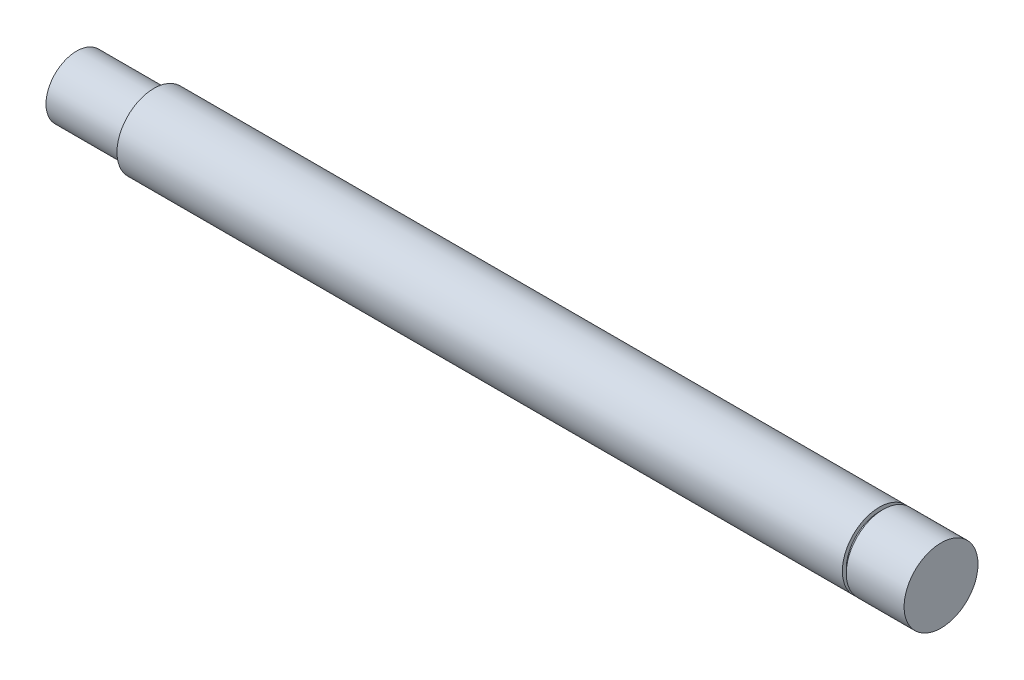
ISO-10303-21;
HEADER;
FILE_DESCRIPTION(('STEP AP214'),'2;1');
FILE_NAME('part.step','',(''),(''),'','','');
FILE_SCHEMA(('AUTOMOTIVE_DESIGN { 1 0 10303 214 1 1 1 1 }'));
ENDSEC;
DATA;
#1=APPLICATION_CONTEXT('core data for automotive mechanical design processes');
#2=APPLICATION_PROTOCOL_DEFINITION('international standard','automotive_design',2000,#1);
#3=PRODUCT_CONTEXT('',#1,'mechanical');
#4=PRODUCT('Part','Part','',(#3));
#5=PRODUCT_RELATED_PRODUCT_CATEGORY('part','',(#4));
#6=PRODUCT_DEFINITION_FORMATION('','',#4);
#7=PRODUCT_DEFINITION_CONTEXT('part definition',#1,'design');
#8=PRODUCT_DEFINITION('design','',#6,#7);
#9=PRODUCT_DEFINITION_SHAPE('','',#8);
#10=(LENGTH_UNIT() NAMED_UNIT(*) SI_UNIT(.MILLI.,.METRE.));
#11=(NAMED_UNIT(*) PLANE_ANGLE_UNIT() SI_UNIT($,.RADIAN.));
#12=(NAMED_UNIT(*) SI_UNIT($,.STERADIAN.) SOLID_ANGLE_UNIT());
#13=UNCERTAINTY_MEASURE_WITH_UNIT(LENGTH_MEASURE(1.E-05),#10,'distance_accuracy_value','');
#14=(GEOMETRIC_REPRESENTATION_CONTEXT(3) GLOBAL_UNCERTAINTY_ASSIGNED_CONTEXT((#13)) GLOBAL_UNIT_ASSIGNED_CONTEXT((#10,
#11,#12)) REPRESENTATION_CONTEXT('',''));
#15=CARTESIAN_POINT('',(0.,0.,0.));
#16=DIRECTION('',(0.,0.,1.));
#17=DIRECTION('',(1.,0.,0.));
#18=AXIS2_PLACEMENT_3D('',#15,#16,#17);
#19=CARTESIAN_POINT('',(177.8,0.,0.));
#20=DIRECTION('',(-1.,0.,0.));
#21=DIRECTION('',(0.,0.,1.));
#22=AXIS2_PLACEMENT_3D('',#19,#20,#21);
#23=CYLINDRICAL_SURFACE('',#22,7.6);
#24=CARTESIAN_POINT('',(165.1,0.,0.));
#25=DIRECTION('',(1.,0.,0.));
#26=DIRECTION('',(0.,0.,-1.));
#27=AXIS2_PLACEMENT_3D('',#24,#25,#26);
#28=CIRCLE('',#27,7.6);
#29=CARTESIAN_POINT('',(165.1,0.,-7.6));
#30=VERTEX_POINT('',#29);
#31=EDGE_CURVE('E39',#30,#30,#28,.T.);
#32=ORIENTED_EDGE('',*,*,#31,.F.);
#33=EDGE_LOOP('',(#32));
#34=FACE_BOUND('',#33,.T.);
#35=CARTESIAN_POINT('',(15.9,0.,0.));
#36=DIRECTION('',(-1.,0.,0.));
#37=DIRECTION('',(0.,0.,1.));
#38=AXIS2_PLACEMENT_3D('',#35,#36,#37);
#39=CIRCLE('',#38,7.6);
#40=CARTESIAN_POINT('',(15.9,0.,7.6));
#41=VERTEX_POINT('',#40);
#42=EDGE_CURVE('E53',#41,#41,#39,.T.);
#43=ORIENTED_EDGE('',*,*,#42,.F.);
#44=EDGE_LOOP('',(#43));
#45=FACE_BOUND('',#44,.T.);
#46=ADVANCED_FACE('F32',(#34,#45),#23,.T.);
#47=CARTESIAN_POINT('',(165.1,0.,0.));
#48=DIRECTION('',(1.,0.,0.));
#49=DIRECTION('',(0.,0.,-1.));
#50=AXIS2_PLACEMENT_3D('',#47,#48,#49);
#51=PLANE('',#50);
#52=CARTESIAN_POINT('',(165.1,0.,0.));
#53=DIRECTION('',(1.,0.,0.));
#54=DIRECTION('',(0.,0.,-1.));
#55=AXIS2_PLACEMENT_3D('',#52,#53,#54);
#56=CIRCLE('',#55,6.8);
#57=CARTESIAN_POINT('',(165.1,0.,-6.8));
#58=VERTEX_POINT('',#57);
#59=EDGE_CURVE('E48',#58,#58,#56,.T.);
#60=ORIENTED_EDGE('',*,*,#59,.F.);
#61=EDGE_LOOP('',(#60));
#62=FACE_BOUND('',#61,.T.);
#63=ORIENTED_EDGE('',*,*,#31,.T.);
#64=EDGE_LOOP('',(#63));
#65=FACE_BOUND('',#64,.T.);
#66=ADVANCED_FACE('F75',(#62,#65),#51,.T.);
#67=CARTESIAN_POINT('',(165.9,0.,0.));
#68=DIRECTION('',(1.,0.,0.));
#69=DIRECTION('',(0.,0.,-1.));
#70=AXIS2_PLACEMENT_3D('',#67,#68,#69);
#71=PLANE('',#70);
#72=CARTESIAN_POINT('',(165.9,0.,0.));
#73=DIRECTION('',(1.,0.,0.));
#74=DIRECTION('',(0.,0.,-1.));
#75=AXIS2_PLACEMENT_3D('',#72,#73,#74);
#76=CIRCLE('',#75,6.8);
#77=CARTESIAN_POINT('',(165.9,0.,-6.8));
#78=VERTEX_POINT('',#77);
#79=EDGE_CURVE('E50',#78,#78,#76,.T.);
#80=ORIENTED_EDGE('',*,*,#79,.T.);
#81=EDGE_LOOP('',(#80));
#82=FACE_BOUND('',#81,.T.);
#83=CARTESIAN_POINT('',(165.9,0.,0.));
#84=DIRECTION('',(1.,0.,0.));
#85=DIRECTION('',(0.,0.,-1.));
#86=AXIS2_PLACEMENT_3D('',#83,#84,#85);
#87=CIRCLE('',#86,7.6);
#88=CARTESIAN_POINT('',(165.9,0.,-7.6));
#89=VERTEX_POINT('',#88);
#90=EDGE_CURVE('E43',#89,#89,#87,.T.);
#91=ORIENTED_EDGE('',*,*,#90,.F.);
#92=EDGE_LOOP('',(#91));
#93=FACE_BOUND('',#92,.T.);
#94=ADVANCED_FACE('F80',(#82,#93),#71,.F.);
#95=CARTESIAN_POINT('',(165.1,0.,0.));
#96=DIRECTION('',(1.,0.,0.));
#97=DIRECTION('',(0.,0.,-1.));
#98=AXIS2_PLACEMENT_3D('',#95,#96,#97);
#99=CYLINDRICAL_SURFACE('',#98,6.8);
#100=ORIENTED_EDGE('',*,*,#59,.T.);
#101=EDGE_LOOP('',(#100));
#102=FACE_BOUND('',#101,.T.);
#103=ORIENTED_EDGE('',*,*,#79,.F.);
#104=EDGE_LOOP('',(#103));
#105=FACE_BOUND('',#104,.T.);
#106=ADVANCED_FACE('F89',(#102,#105),#99,.T.);
#107=CARTESIAN_POINT('',(177.8,0.,0.));
#108=DIRECTION('',(1.,0.,0.));
#109=DIRECTION('',(0.,0.,-1.));
#110=AXIS2_PLACEMENT_3D('',#107,#108,#109);
#111=PLANE('',#110);
#112=CARTESIAN_POINT('',(177.8,0.,0.));
#113=DIRECTION('',(1.,0.,0.));
#114=DIRECTION('',(0.,0.,-1.));
#115=AXIS2_PLACEMENT_3D('',#112,#113,#114);
#116=CIRCLE('',#115,7.6);
#117=CARTESIAN_POINT('',(177.8,0.,-7.6));
#118=VERTEX_POINT('',#117);
#119=EDGE_CURVE('E10',#118,#118,#116,.T.);
#120=ORIENTED_EDGE('',*,*,#119,.T.);
#121=EDGE_LOOP('',(#120));
#122=FACE_BOUND('',#121,.T.);
#123=ADVANCED_FACE('F84',(#122),#111,.T.);
#124=ORIENTED_EDGE('',*,*,#90,.T.);
#125=EDGE_LOOP('',(#124));
#126=FACE_BOUND('',#125,.T.);
#127=ORIENTED_EDGE('',*,*,#119,.F.);
#128=EDGE_LOOP('',(#127));
#129=FACE_BOUND('',#128,.T.);
#130=ADVANCED_FACE('F34',(#126,#129),#23,.T.);
#131=CARTESIAN_POINT('',(15.9,0.,0.));
#132=DIRECTION('',(-1.,0.,0.));
#133=DIRECTION('',(0.,0.,1.));
#134=AXIS2_PLACEMENT_3D('',#131,#132,#133);
#135=PLANE('',#134);
#136=CARTESIAN_POINT('',(15.9,0.,0.));
#137=DIRECTION('',(-1.,0.,0.));
#138=DIRECTION('',(0.,0.,1.));
#139=AXIS2_PLACEMENT_3D('',#136,#137,#138);
#140=CIRCLE('',#139,6.3);
#141=CARTESIAN_POINT('',(15.9,0.,6.3));
#142=VERTEX_POINT('',#141);
#143=EDGE_CURVE('E58',#142,#142,#140,.T.);
#144=ORIENTED_EDGE('',*,*,#143,.F.);
#145=EDGE_LOOP('',(#144));
#146=FACE_BOUND('',#145,.T.);
#147=ORIENTED_EDGE('',*,*,#42,.T.);
#148=EDGE_LOOP('',(#147));
#149=FACE_BOUND('',#148,.T.);
#150=ADVANCED_FACE('F68',(#146,#149),#135,.T.);
#151=CARTESIAN_POINT('',(15.9,0.,0.));
#152=DIRECTION('',(-1.,0.,0.));
#153=DIRECTION('',(0.,0.,1.));
#154=AXIS2_PLACEMENT_3D('',#151,#152,#153);
#155=CYLINDRICAL_SURFACE('',#154,6.3);
#156=ORIENTED_EDGE('',*,*,#143,.T.);
#157=EDGE_LOOP('',(#156));
#158=FACE_BOUND('',#157,.T.);
#159=CARTESIAN_POINT('',(0.,0.,0.));
#160=DIRECTION('',(-1.,0.,0.));
#161=DIRECTION('',(0.,0.,1.));
#162=AXIS2_PLACEMENT_3D('',#159,#160,#161);
#163=CIRCLE('',#162,6.3);
#164=CARTESIAN_POINT('',(0.,0.,6.3));
#165=VERTEX_POINT('',#164);
#166=EDGE_CURVE('E59',#165,#165,#163,.T.);
#167=ORIENTED_EDGE('',*,*,#166,.F.);
#168=EDGE_LOOP('',(#167));
#169=FACE_BOUND('',#168,.T.);
#170=ADVANCED_FACE('F65',(#158,#169),#155,.T.);
#171=CARTESIAN_POINT('',(0.,0.,0.));
#172=DIRECTION('',(1.,0.,0.));
#173=DIRECTION('',(0.,0.,-1.));
#174=AXIS2_PLACEMENT_3D('',#171,#172,#173);
#175=PLANE('',#174);
#176=ORIENTED_EDGE('',*,*,#166,.T.);
#177=EDGE_LOOP('',(#176));
#178=FACE_BOUND('',#177,.T.);
#179=ADVANCED_FACE('F102',(#178),#175,.F.);
#180=CLOSED_SHELL('',(#46,#66,#94,#106,#123,#130,#150,#170,#179));
#181=MANIFOLD_SOLID_BREP('B2',#180);
#182=ADVANCED_BREP_SHAPE_REPRESENTATION('',(#18,#181),#14);
#183=SHAPE_DEFINITION_REPRESENTATION(#9,#182);
ENDSEC;
END-ISO-10303-21;
